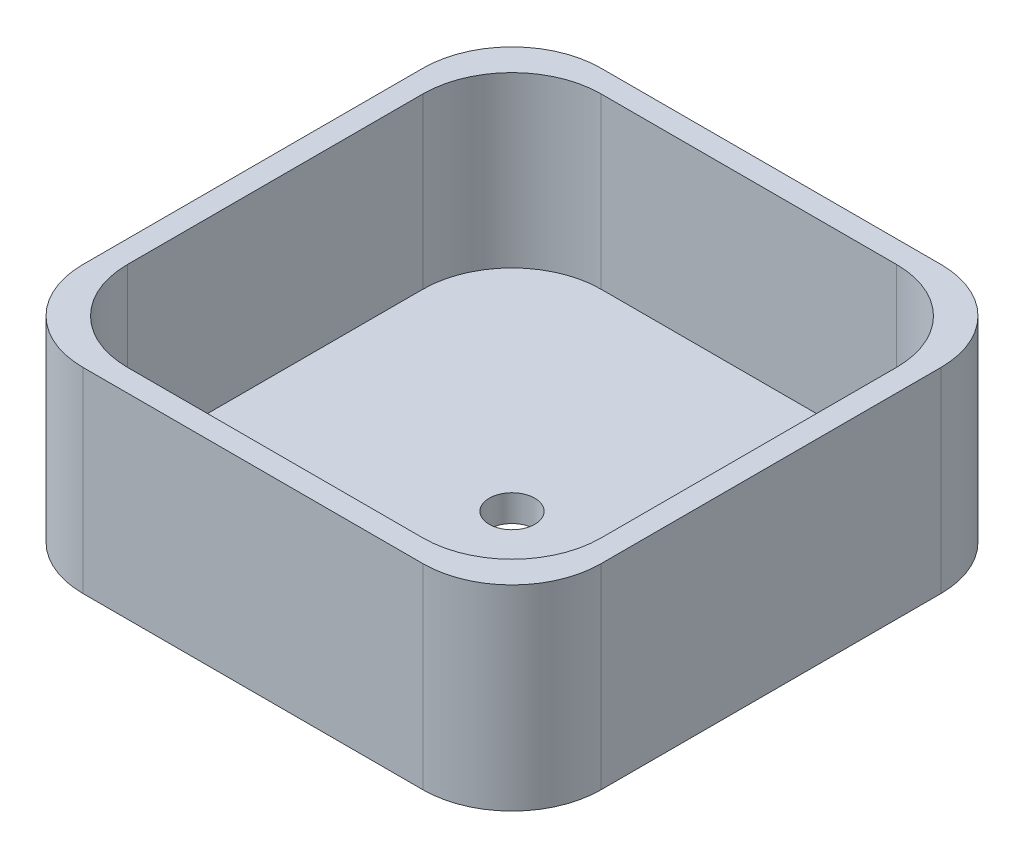
ISO-10303-21;
HEADER;
FILE_DESCRIPTION(('STEP AP214'),'2;1');
FILE_NAME('part.step','',(''),(''),'','','');
FILE_SCHEMA(('AUTOMOTIVE_DESIGN { 1 0 10303 214 1 1 1 1 }'));
ENDSEC;
DATA;
#1=APPLICATION_CONTEXT('core data for automotive mechanical design processes');
#2=APPLICATION_PROTOCOL_DEFINITION('international standard','automotive_design',2000,#1);
#3=PRODUCT_CONTEXT('',#1,'mechanical');
#4=PRODUCT('Part','Part','',(#3));
#5=PRODUCT_RELATED_PRODUCT_CATEGORY('part','',(#4));
#6=PRODUCT_DEFINITION_FORMATION('','',#4);
#7=PRODUCT_DEFINITION_CONTEXT('part definition',#1,'design');
#8=PRODUCT_DEFINITION('design','',#6,#7);
#9=PRODUCT_DEFINITION_SHAPE('','',#8);
#10=(LENGTH_UNIT() NAMED_UNIT(*) SI_UNIT(.MILLI.,.METRE.));
#11=(NAMED_UNIT(*) PLANE_ANGLE_UNIT() SI_UNIT($,.RADIAN.));
#12=(NAMED_UNIT(*) SI_UNIT($,.STERADIAN.) SOLID_ANGLE_UNIT());
#13=UNCERTAINTY_MEASURE_WITH_UNIT(LENGTH_MEASURE(1.E-05),#10,'distance_accuracy_value','');
#14=(GEOMETRIC_REPRESENTATION_CONTEXT(3) GLOBAL_UNCERTAINTY_ASSIGNED_CONTEXT((#13)) GLOBAL_UNIT_ASSIGNED_CONTEXT((#10,
#11,#12)) REPRESENTATION_CONTEXT('',''));
#15=CARTESIAN_POINT('',(0.,0.,0.));
#16=DIRECTION('',(0.,0.,1.));
#17=DIRECTION('',(1.,0.,0.));
#18=AXIS2_PLACEMENT_3D('',#15,#16,#17);
#19=CARTESIAN_POINT('',(-29.1,22.,29.1));
#20=DIRECTION('',(-1.,0.,0.));
#21=DIRECTION('',(0.,0.,1.));
#22=AXIS2_PLACEMENT_3D('',#19,#20,#21);
#23=PLANE('',#22);
#24=DIRECTION('',(0.,0.,-1.));
#25=VECTOR('',#24,1.);
#26=CARTESIAN_POINT('',(-29.1,22.,29.1));
#27=LINE('',#26,#25);
#28=CARTESIAN_POINT('',(-29.1,22.,19.1));
#29=VERTEX_POINT('',#28);
#30=CARTESIAN_POINT('',(-29.1,22.,-19.1));
#31=VERTEX_POINT('',#30);
#32=EDGE_CURVE('E309',#29,#31,#27,.T.);
#33=ORIENTED_EDGE('',*,*,#32,.T.);
#34=DIRECTION('',(0.,-1.,0.));
#35=VECTOR('',#34,1.);
#36=CARTESIAN_POINT('',(-29.1,22.,-19.1));
#37=LINE('',#36,#35);
#38=CARTESIAN_POINT('',(-29.1,0.,-19.1));
#39=VERTEX_POINT('',#38);
#40=EDGE_CURVE('E238',#31,#39,#37,.T.);
#41=ORIENTED_EDGE('',*,*,#40,.T.);
#42=DIRECTION('',(0.,0.,-1.));
#43=VECTOR('',#42,1.);
#44=CARTESIAN_POINT('',(-29.1,0.,29.1));
#45=LINE('',#44,#43);
#46=CARTESIAN_POINT('',(-29.1,0.,19.1));
#47=VERTEX_POINT('',#46);
#48=EDGE_CURVE('E186',#47,#39,#45,.T.);
#49=ORIENTED_EDGE('',*,*,#48,.F.);
#50=DIRECTION('',(0.,-1.,0.));
#51=VECTOR('',#50,1.);
#52=CARTESIAN_POINT('',(-29.1,22.,19.1));
#53=LINE('',#52,#51);
#54=EDGE_CURVE('E235',#47,#29,#53,.F.);
#55=ORIENTED_EDGE('',*,*,#54,.T.);
#56=EDGE_LOOP('',(#33,#41,#49,#55));
#57=FACE_BOUND('',#56,.T.);
#58=ADVANCED_FACE('F65',(#57),#23,.T.);
#59=CARTESIAN_POINT('',(-29.1,22.,29.1));
#60=DIRECTION('',(0.,0.,-1.));
#61=DIRECTION('',(-1.,0.,0.));
#62=AXIS2_PLACEMENT_3D('',#59,#60,#61);
#63=PLANE('',#62);
#64=DIRECTION('',(1.,0.,0.));
#65=VECTOR('',#64,1.);
#66=CARTESIAN_POINT('',(-29.1,22.,29.1));
#67=LINE('',#66,#65);
#68=CARTESIAN_POINT('',(-19.1,22.,29.1));
#69=VERTEX_POINT('',#68);
#70=CARTESIAN_POINT('',(19.1,22.,29.1));
#71=VERTEX_POINT('',#70);
#72=EDGE_CURVE('E209',#69,#71,#67,.T.);
#73=ORIENTED_EDGE('',*,*,#72,.F.);
#74=DIRECTION('',(0.,-1.,0.));
#75=VECTOR('',#74,1.);
#76=CARTESIAN_POINT('',(-19.1,0.,29.1));
#77=LINE('',#76,#75);
#78=CARTESIAN_POINT('',(-19.1,0.,29.1));
#79=VERTEX_POINT('',#78);
#80=EDGE_CURVE('E244',#69,#79,#77,.T.);
#81=ORIENTED_EDGE('',*,*,#80,.T.);
#82=DIRECTION('',(1.,0.,0.));
#83=VECTOR('',#82,1.);
#84=CARTESIAN_POINT('',(-29.1,0.,29.1));
#85=LINE('',#84,#83);
#86=CARTESIAN_POINT('',(19.1,0.,29.1));
#87=VERTEX_POINT('',#86);
#88=EDGE_CURVE('E219',#79,#87,#85,.T.);
#89=ORIENTED_EDGE('',*,*,#88,.T.);
#90=DIRECTION('',(0.,-1.,0.));
#91=VECTOR('',#90,1.);
#92=CARTESIAN_POINT('',(19.1,22.,29.1));
#93=LINE('',#92,#91);
#94=EDGE_CURVE('E241',#87,#71,#93,.F.);
#95=ORIENTED_EDGE('',*,*,#94,.T.);
#96=EDGE_LOOP('',(#73,#81,#89,#95));
#97=FACE_BOUND('',#96,.T.);
#98=ADVANCED_FACE('F345',(#97),#63,.F.);
#99=CARTESIAN_POINT('',(29.1,22.,29.1));
#100=DIRECTION('',(-1.,0.,0.));
#101=DIRECTION('',(0.,0.,1.));
#102=AXIS2_PLACEMENT_3D('',#99,#100,#101);
#103=PLANE('',#102);
#104=DIRECTION('',(0.,0.,-1.));
#105=VECTOR('',#104,1.);
#106=CARTESIAN_POINT('',(29.1,0.,29.1));
#107=LINE('',#106,#105);
#108=CARTESIAN_POINT('',(29.1,0.,19.1));
#109=VERTEX_POINT('',#108);
#110=CARTESIAN_POINT('',(29.1,0.,-19.1));
#111=VERTEX_POINT('',#110);
#112=EDGE_CURVE('E204',#109,#111,#107,.T.);
#113=ORIENTED_EDGE('',*,*,#112,.T.);
#114=DIRECTION('',(0.,-1.,0.));
#115=VECTOR('',#114,1.);
#116=CARTESIAN_POINT('',(29.1,22.,-19.1));
#117=LINE('',#116,#115);
#118=CARTESIAN_POINT('',(29.1,22.,-19.1));
#119=VERTEX_POINT('',#118);
#120=EDGE_CURVE('E232',#111,#119,#117,.F.);
#121=ORIENTED_EDGE('',*,*,#120,.T.);
#122=DIRECTION('',(0.,0.,-1.));
#123=VECTOR('',#122,1.);
#124=CARTESIAN_POINT('',(29.1,22.,29.1));
#125=LINE('',#124,#123);
#126=CARTESIAN_POINT('',(29.1,22.,19.1));
#127=VERTEX_POINT('',#126);
#128=EDGE_CURVE('E216',#127,#119,#125,.T.);
#129=ORIENTED_EDGE('',*,*,#128,.F.);
#130=DIRECTION('',(0.,-1.,0.));
#131=VECTOR('',#130,1.);
#132=CARTESIAN_POINT('',(29.1,22.,19.1));
#133=LINE('',#132,#131);
#134=EDGE_CURVE('E228',#127,#109,#133,.T.);
#135=ORIENTED_EDGE('',*,*,#134,.T.);
#136=EDGE_LOOP('',(#113,#121,#129,#135));
#137=FACE_BOUND('',#136,.T.);
#138=ADVANCED_FACE('F332',(#137),#103,.F.);
#139=CARTESIAN_POINT('',(-29.1,22.,-29.1));
#140=DIRECTION('',(0.,0.,-1.));
#141=DIRECTION('',(-1.,0.,0.));
#142=AXIS2_PLACEMENT_3D('',#139,#140,#141);
#143=PLANE('',#142);
#144=DIRECTION('',(1.,0.,0.));
#145=VECTOR('',#144,1.);
#146=CARTESIAN_POINT('',(-29.1,22.,-29.1));
#147=LINE('',#146,#145);
#148=CARTESIAN_POINT('',(-19.1,22.,-29.1));
#149=VERTEX_POINT('',#148);
#150=CARTESIAN_POINT('',(19.1,22.,-29.1));
#151=VERTEX_POINT('',#150);
#152=EDGE_CURVE('E311',#149,#151,#147,.T.);
#153=ORIENTED_EDGE('',*,*,#152,.T.);
#154=DIRECTION('',(0.,-1.,0.));
#155=VECTOR('',#154,1.);
#156=CARTESIAN_POINT('',(19.1,0.,-29.1));
#157=LINE('',#156,#155);
#158=CARTESIAN_POINT('',(19.1,0.,-29.1));
#159=VERTEX_POINT('',#158);
#160=EDGE_CURVE('E202',#151,#159,#157,.T.);
#161=ORIENTED_EDGE('',*,*,#160,.T.);
#162=DIRECTION('',(1.,0.,0.));
#163=VECTOR('',#162,1.);
#164=CARTESIAN_POINT('',(-29.1,0.,-29.1));
#165=LINE('',#164,#163);
#166=CARTESIAN_POINT('',(-19.1,0.,-29.1));
#167=VERTEX_POINT('',#166);
#168=EDGE_CURVE('E184',#167,#159,#165,.T.);
#169=ORIENTED_EDGE('',*,*,#168,.F.);
#170=DIRECTION('',(0.,-1.,0.));
#171=VECTOR('',#170,1.);
#172=CARTESIAN_POINT('',(-19.1,22.,-29.1));
#173=LINE('',#172,#171);
#174=EDGE_CURVE('E199',#167,#149,#173,.F.);
#175=ORIENTED_EDGE('',*,*,#174,.T.);
#176=EDGE_LOOP('',(#153,#161,#169,#175));
#177=FACE_BOUND('',#176,.T.);
#178=ADVANCED_FACE('F198',(#177),#143,.T.);
#179=CARTESIAN_POINT('',(0.,22.,0.));
#180=DIRECTION('',(0.,-1.,0.));
#181=DIRECTION('',(0.,0.,-1.));
#182=AXIS2_PLACEMENT_3D('',#179,#180,#181);
#183=PLANE('',#182);
#184=DIRECTION('',(1.,0.,0.));
#185=VECTOR('',#184,1.);
#186=CARTESIAN_POINT('',(-26.6,22.,26.6));
#187=LINE('',#186,#185);
#188=CARTESIAN_POINT('',(-16.6,22.,26.6));
#189=VERTEX_POINT('',#188);
#190=CARTESIAN_POINT('',(16.6,22.,26.6));
#191=VERTEX_POINT('',#190);
#192=EDGE_CURVE('E559',#189,#191,#187,.T.);
#193=ORIENTED_EDGE('',*,*,#192,.F.);
#194=CARTESIAN_POINT('',(-16.6,22.,16.6));
#195=DIRECTION('',(0.,-1.,0.));
#196=DIRECTION('',(0.,0.,-1.));
#197=AXIS2_PLACEMENT_3D('',#194,#195,#196);
#198=CIRCLE('',#197,10.);
#199=CARTESIAN_POINT('',(-26.6,22.,16.6));
#200=VERTEX_POINT('',#199);
#201=EDGE_CURVE('E290',#189,#200,#198,.T.);
#202=ORIENTED_EDGE('',*,*,#201,.T.);
#203=DIRECTION('',(0.,0.,-1.));
#204=VECTOR('',#203,1.);
#205=CARTESIAN_POINT('',(-26.6,22.,26.6));
#206=LINE('',#205,#204);
#207=CARTESIAN_POINT('',(-26.6,22.,-16.6));
#208=VERTEX_POINT('',#207);
#209=EDGE_CURVE('E321',#200,#208,#206,.T.);
#210=ORIENTED_EDGE('',*,*,#209,.T.);
#211=CARTESIAN_POINT('',(-16.6,22.,-16.6));
#212=DIRECTION('',(0.,-1.,0.));
#213=DIRECTION('',(0.,0.,-1.));
#214=AXIS2_PLACEMENT_3D('',#211,#212,#213);
#215=CIRCLE('',#214,10.);
#216=CARTESIAN_POINT('',(-16.6,22.,-26.6));
#217=VERTEX_POINT('',#216);
#218=EDGE_CURVE('E88',#208,#217,#215,.T.);
#219=ORIENTED_EDGE('',*,*,#218,.T.);
#220=DIRECTION('',(1.,0.,0.));
#221=VECTOR('',#220,1.);
#222=CARTESIAN_POINT('',(-26.6,22.,-26.6));
#223=LINE('',#222,#221);
#224=CARTESIAN_POINT('',(16.6,22.,-26.6));
#225=VERTEX_POINT('',#224);
#226=EDGE_CURVE('E533',#217,#225,#223,.T.);
#227=ORIENTED_EDGE('',*,*,#226,.T.);
#228=CARTESIAN_POINT('',(16.6,22.,-16.6));
#229=DIRECTION('',(0.,-1.,0.));
#230=DIRECTION('',(0.,0.,-1.));
#231=AXIS2_PLACEMENT_3D('',#228,#229,#230);
#232=CIRCLE('',#231,10.);
#233=CARTESIAN_POINT('',(26.6,22.,-16.6));
#234=VERTEX_POINT('',#233);
#235=EDGE_CURVE('E293',#225,#234,#232,.T.);
#236=ORIENTED_EDGE('',*,*,#235,.T.);
#237=DIRECTION('',(0.,0.,-1.));
#238=VECTOR('',#237,1.);
#239=CARTESIAN_POINT('',(26.6,22.,26.6));
#240=LINE('',#239,#238);
#241=CARTESIAN_POINT('',(26.6,22.,16.6));
#242=VERTEX_POINT('',#241);
#243=EDGE_CURVE('E556',#242,#234,#240,.T.);
#244=ORIENTED_EDGE('',*,*,#243,.F.);
#245=CARTESIAN_POINT('',(16.6,22.,16.6));
#246=DIRECTION('',(0.,-1.,0.));
#247=DIRECTION('',(0.,0.,-1.));
#248=AXIS2_PLACEMENT_3D('',#245,#246,#247);
#249=CIRCLE('',#248,10.);
#250=EDGE_CURVE('E287',#242,#191,#249,.T.);
#251=ORIENTED_EDGE('',*,*,#250,.T.);
#252=EDGE_LOOP('',(#193,#202,#210,#219,#227,#236,#244,#251));
#253=FACE_BOUND('',#252,.T.);
#254=ORIENTED_EDGE('',*,*,#128,.T.);
#255=CARTESIAN_POINT('',(19.1,22.,-19.1));
#256=DIRECTION('',(0.,-1.,0.));
#257=DIRECTION('',(0.,0.,-1.));
#258=AXIS2_PLACEMENT_3D('',#255,#256,#257);
#259=CIRCLE('',#258,10.);
#260=EDGE_CURVE('E12',#119,#151,#259,.F.);
#261=ORIENTED_EDGE('',*,*,#260,.T.);
#262=ORIENTED_EDGE('',*,*,#152,.F.);
#263=CARTESIAN_POINT('',(-19.1,22.,-19.1));
#264=DIRECTION('',(0.,-1.,0.));
#265=DIRECTION('',(0.,0.,-1.));
#266=AXIS2_PLACEMENT_3D('',#263,#264,#265);
#267=CIRCLE('',#266,10.);
#268=EDGE_CURVE('E74',#149,#31,#267,.F.);
#269=ORIENTED_EDGE('',*,*,#268,.T.);
#270=ORIENTED_EDGE('',*,*,#32,.F.);
#271=CARTESIAN_POINT('',(-19.1,22.,19.1));
#272=DIRECTION('',(0.,-1.,0.));
#273=DIRECTION('',(0.,0.,-1.));
#274=AXIS2_PLACEMENT_3D('',#271,#272,#273);
#275=CIRCLE('',#274,10.);
#276=EDGE_CURVE('E301',#29,#69,#275,.F.);
#277=ORIENTED_EDGE('',*,*,#276,.T.);
#278=ORIENTED_EDGE('',*,*,#72,.T.);
#279=CARTESIAN_POINT('',(19.1,22.,19.1));
#280=DIRECTION('',(0.,-1.,0.));
#281=DIRECTION('',(0.,0.,-1.));
#282=AXIS2_PLACEMENT_3D('',#279,#280,#281);
#283=CIRCLE('',#282,10.);
#284=EDGE_CURVE('E298',#71,#127,#283,.F.);
#285=ORIENTED_EDGE('',*,*,#284,.T.);
#286=EDGE_LOOP('',(#254,#261,#262,#269,#270,#277,#278,#285));
#287=FACE_BOUND('',#286,.T.);
#288=ADVANCED_FACE('F308',(#253,#287),#183,.F.);
#289=CARTESIAN_POINT('',(0.,0.,0.));
#290=DIRECTION('',(0.,-1.,0.));
#291=DIRECTION('',(0.,0.,-1.));
#292=AXIS2_PLACEMENT_3D('',#289,#290,#291);
#293=PLANE('',#292);
#294=ORIENTED_EDGE('',*,*,#168,.T.);
#295=CARTESIAN_POINT('',(19.1,0.,-19.1));
#296=DIRECTION('',(0.,-1.,0.));
#297=DIRECTION('',(0.,0.,-1.));
#298=AXIS2_PLACEMENT_3D('',#295,#296,#297);
#299=CIRCLE('',#298,10.);
#300=EDGE_CURVE('E192',#159,#111,#299,.T.);
#301=ORIENTED_EDGE('',*,*,#300,.T.);
#302=ORIENTED_EDGE('',*,*,#112,.F.);
#303=CARTESIAN_POINT('',(19.1,0.,19.1));
#304=DIRECTION('',(0.,-1.,0.));
#305=DIRECTION('',(0.,0.,-1.));
#306=AXIS2_PLACEMENT_3D('',#303,#304,#305);
#307=CIRCLE('',#306,10.);
#308=EDGE_CURVE('E213',#109,#87,#307,.T.);
#309=ORIENTED_EDGE('',*,*,#308,.T.);
#310=ORIENTED_EDGE('',*,*,#88,.F.);
#311=CARTESIAN_POINT('',(-19.1,0.,19.1));
#312=DIRECTION('',(0.,-1.,0.));
#313=DIRECTION('',(0.,0.,-1.));
#314=AXIS2_PLACEMENT_3D('',#311,#312,#313);
#315=CIRCLE('',#314,10.);
#316=EDGE_CURVE('E193',#79,#47,#315,.T.);
#317=ORIENTED_EDGE('',*,*,#316,.T.);
#318=ORIENTED_EDGE('',*,*,#48,.T.);
#319=CARTESIAN_POINT('',(-19.1,0.,-19.1));
#320=DIRECTION('',(0.,-1.,0.));
#321=DIRECTION('',(0.,0.,-1.));
#322=AXIS2_PLACEMENT_3D('',#319,#320,#321);
#323=CIRCLE('',#322,10.);
#324=EDGE_CURVE('E180',#39,#167,#323,.T.);
#325=ORIENTED_EDGE('',*,*,#324,.T.);
#326=EDGE_LOOP('',(#294,#301,#302,#309,#310,#317,#318,#325));
#327=FACE_BOUND('',#326,.T.);
#328=CARTESIAN_POINT('',(0.,0.,0.));
#329=DIRECTION('',(0.,1.,0.));
#330=DIRECTION('',(0.,0.,1.));
#331=AXIS2_PLACEMENT_3D('',#328,#329,#330);
#332=CIRCLE('',#331,2.55);
#333=CARTESIAN_POINT('',(0.,0.,2.55000000000001));
#334=VERTEX_POINT('',#333);
#335=EDGE_CURVE('E549',#334,#334,#332,.T.);
#336=ORIENTED_EDGE('',*,*,#335,.T.);
#337=EDGE_LOOP('',(#336));
#338=FACE_BOUND('',#337,.T.);
#339=ADVANCED_FACE('F182',(#327,#338),#293,.T.);
#340=CARTESIAN_POINT('',(-26.6,22.,-26.6));
#341=DIRECTION('',(0.,0.,-1.));
#342=DIRECTION('',(-1.,0.,0.));
#343=AXIS2_PLACEMENT_3D('',#340,#341,#342);
#344=PLANE('',#343);
#345=DIRECTION('',(1.,0.,0.));
#346=VECTOR('',#345,1.);
#347=CARTESIAN_POINT('',(0.,3.,-26.6));
#348=LINE('',#347,#346);
#349=CARTESIAN_POINT('',(-16.6,3.,-26.6));
#350=VERTEX_POINT('',#349);
#351=CARTESIAN_POINT('',(16.6,3.,-26.6));
#352=VERTEX_POINT('',#351);
#353=EDGE_CURVE('E532',#350,#352,#348,.T.);
#354=ORIENTED_EDGE('',*,*,#353,.T.);
#355=DIRECTION('',(0.,-1.,0.));
#356=VECTOR('',#355,1.);
#357=CARTESIAN_POINT('',(16.6,22.,-26.6));
#358=LINE('',#357,#356);
#359=EDGE_CURVE('E81',#352,#225,#358,.F.);
#360=ORIENTED_EDGE('',*,*,#359,.T.);
#361=ORIENTED_EDGE('',*,*,#226,.F.);
#362=DIRECTION('',(0.,-1.,0.));
#363=VECTOR('',#362,1.);
#364=CARTESIAN_POINT('',(-16.6,3.,-26.6));
#365=LINE('',#364,#363);
#366=EDGE_CURVE('E281',#217,#350,#365,.T.);
#367=ORIENTED_EDGE('',*,*,#366,.T.);
#368=EDGE_LOOP('',(#354,#360,#361,#367));
#369=FACE_BOUND('',#368,.T.);
#370=ADVANCED_FACE('F388',(#369),#344,.F.);
#371=CARTESIAN_POINT('',(-26.6,22.,26.6));
#372=DIRECTION('',(-1.,0.,0.));
#373=DIRECTION('',(0.,0.,1.));
#374=AXIS2_PLACEMENT_3D('',#371,#372,#373);
#375=PLANE('',#374);
#376=ORIENTED_EDGE('',*,*,#209,.F.);
#377=DIRECTION('',(0.,-1.,0.));
#378=VECTOR('',#377,1.);
#379=CARTESIAN_POINT('',(-26.6,22.,16.6));
#380=LINE('',#379,#378);
#381=CARTESIAN_POINT('',(-26.6,3.,16.6));
#382=VERTEX_POINT('',#381);
#383=EDGE_CURVE('E277',#200,#382,#380,.T.);
#384=ORIENTED_EDGE('',*,*,#383,.T.);
#385=DIRECTION('',(0.,0.,-1.));
#386=VECTOR('',#385,1.);
#387=CARTESIAN_POINT('',(-26.6,3.,0.));
#388=LINE('',#387,#386);
#389=CARTESIAN_POINT('',(-26.6,3.,-16.6));
#390=VERTEX_POINT('',#389);
#391=EDGE_CURVE('E539',#382,#390,#388,.T.);
#392=ORIENTED_EDGE('',*,*,#391,.T.);
#393=DIRECTION('',(0.,-1.,0.));
#394=VECTOR('',#393,1.);
#395=CARTESIAN_POINT('',(-26.6,22.,-16.6));
#396=LINE('',#395,#394);
#397=EDGE_CURVE('E274',#390,#208,#396,.F.);
#398=ORIENTED_EDGE('',*,*,#397,.T.);
#399=EDGE_LOOP('',(#376,#384,#392,#398));
#400=FACE_BOUND('',#399,.T.);
#401=ADVANCED_FACE('F384',(#400),#375,.F.);
#402=CARTESIAN_POINT('',(-26.6,22.,26.6));
#403=DIRECTION('',(0.,0.,-1.));
#404=DIRECTION('',(-1.,0.,0.));
#405=AXIS2_PLACEMENT_3D('',#402,#403,#404);
#406=PLANE('',#405);
#407=ORIENTED_EDGE('',*,*,#192,.T.);
#408=DIRECTION('',(0.,-1.,0.));
#409=VECTOR('',#408,1.);
#410=CARTESIAN_POINT('',(16.6,3.,26.6));
#411=LINE('',#410,#409);
#412=CARTESIAN_POINT('',(16.6,3.,26.6));
#413=VERTEX_POINT('',#412);
#414=EDGE_CURVE('E251',#191,#413,#411,.T.);
#415=ORIENTED_EDGE('',*,*,#414,.T.);
#416=DIRECTION('',(1.,0.,0.));
#417=VECTOR('',#416,1.);
#418=CARTESIAN_POINT('',(0.,3.,26.6));
#419=LINE('',#418,#417);
#420=CARTESIAN_POINT('',(-16.6,3.,26.6));
#421=VERTEX_POINT('',#420);
#422=EDGE_CURVE('E545',#421,#413,#419,.T.);
#423=ORIENTED_EDGE('',*,*,#422,.F.);
#424=DIRECTION('',(0.,-1.,0.));
#425=VECTOR('',#424,1.);
#426=CARTESIAN_POINT('',(-16.6,22.,26.6));
#427=LINE('',#426,#425);
#428=EDGE_CURVE('E248',#421,#189,#427,.F.);
#429=ORIENTED_EDGE('',*,*,#428,.T.);
#430=EDGE_LOOP('',(#407,#415,#423,#429));
#431=FACE_BOUND('',#430,.T.);
#432=ADVANCED_FACE('F387',(#431),#406,.T.);
#433=CARTESIAN_POINT('',(26.6,22.,26.6));
#434=DIRECTION('',(-1.,0.,0.));
#435=DIRECTION('',(0.,0.,1.));
#436=AXIS2_PLACEMENT_3D('',#433,#434,#435);
#437=PLANE('',#436);
#438=DIRECTION('',(0.,0.,-1.));
#439=VECTOR('',#438,1.);
#440=CARTESIAN_POINT('',(26.6,3.,0.));
#441=LINE('',#440,#439);
#442=CARTESIAN_POINT('',(26.6,3.,16.6));
#443=VERTEX_POINT('',#442);
#444=CARTESIAN_POINT('',(26.6,3.,-16.6));
#445=VERTEX_POINT('',#444);
#446=EDGE_CURVE('E540',#443,#445,#441,.T.);
#447=ORIENTED_EDGE('',*,*,#446,.F.);
#448=DIRECTION('',(0.,-1.,0.));
#449=VECTOR('',#448,1.);
#450=CARTESIAN_POINT('',(26.6,22.,16.6));
#451=LINE('',#450,#449);
#452=EDGE_CURVE('E271',#443,#242,#451,.F.);
#453=ORIENTED_EDGE('',*,*,#452,.T.);
#454=ORIENTED_EDGE('',*,*,#243,.T.);
#455=DIRECTION('',(0.,-1.,0.));
#456=VECTOR('',#455,1.);
#457=CARTESIAN_POINT('',(26.6,22.,-16.6));
#458=LINE('',#457,#456);
#459=EDGE_CURVE('E267',#234,#445,#458,.T.);
#460=ORIENTED_EDGE('',*,*,#459,.T.);
#461=EDGE_LOOP('',(#447,#453,#454,#460));
#462=FACE_BOUND('',#461,.T.);
#463=ADVANCED_FACE('F378',(#462),#437,.T.);
#464=CARTESIAN_POINT('',(0.,3.,0.));
#465=DIRECTION('',(0.,-1.,0.));
#466=DIRECTION('',(0.,0.,-1.));
#467=AXIS2_PLACEMENT_3D('',#464,#465,#466);
#468=CYLINDRICAL_SURFACE('',#467,2.55);
#469=CARTESIAN_POINT('',(0.,3.,0.));
#470=DIRECTION('',(0.,1.,0.));
#471=DIRECTION('',(0.,0.,1.));
#472=AXIS2_PLACEMENT_3D('',#469,#470,#471);
#473=CIRCLE('',#472,2.55);
#474=CARTESIAN_POINT('',(0.,3.,2.55000000000001));
#475=VERTEX_POINT('',#474);
#476=EDGE_CURVE('E553',#475,#475,#473,.T.);
#477=ORIENTED_EDGE('',*,*,#476,.T.);
#478=EDGE_LOOP('',(#477));
#479=FACE_BOUND('',#478,.T.);
#480=ORIENTED_EDGE('',*,*,#335,.F.);
#481=EDGE_LOOP('',(#480));
#482=FACE_BOUND('',#481,.T.);
#483=ADVANCED_FACE('F372',(#479,#482),#468,.F.);
#484=CARTESIAN_POINT('',(0.,3.,0.));
#485=DIRECTION('',(0.,1.,0.));
#486=DIRECTION('',(0.,0.,1.));
#487=AXIS2_PLACEMENT_3D('',#484,#485,#486);
#488=PLANE('',#487);
#489=ORIENTED_EDGE('',*,*,#476,.F.);
#490=EDGE_LOOP('',(#489));
#491=FACE_BOUND('',#490,.T.);
#492=ORIENTED_EDGE('',*,*,#422,.T.);
#493=CARTESIAN_POINT('',(16.6,3.,16.6));
#494=DIRECTION('',(0.,1.,0.));
#495=DIRECTION('',(0.,0.,1.));
#496=AXIS2_PLACEMENT_3D('',#493,#494,#495);
#497=CIRCLE('',#496,10.);
#498=EDGE_CURVE('E264',#413,#443,#497,.T.);
#499=ORIENTED_EDGE('',*,*,#498,.T.);
#500=ORIENTED_EDGE('',*,*,#446,.T.);
#501=CARTESIAN_POINT('',(16.6,3.,-16.6));
#502=DIRECTION('',(0.,1.,0.));
#503=DIRECTION('',(0.,0.,1.));
#504=AXIS2_PLACEMENT_3D('',#501,#502,#503);
#505=CIRCLE('',#504,10.);
#506=EDGE_CURVE('E258',#445,#352,#505,.T.);
#507=ORIENTED_EDGE('',*,*,#506,.T.);
#508=ORIENTED_EDGE('',*,*,#353,.F.);
#509=CARTESIAN_POINT('',(-16.6,3.,-16.6));
#510=DIRECTION('',(0.,1.,0.));
#511=DIRECTION('',(0.,0.,1.));
#512=AXIS2_PLACEMENT_3D('',#509,#510,#511);
#513=CIRCLE('',#512,10.);
#514=EDGE_CURVE('E255',#350,#390,#513,.T.);
#515=ORIENTED_EDGE('',*,*,#514,.T.);
#516=ORIENTED_EDGE('',*,*,#391,.F.);
#517=CARTESIAN_POINT('',(-16.6,3.,16.6));
#518=DIRECTION('',(0.,1.,0.));
#519=DIRECTION('',(0.,0.,1.));
#520=AXIS2_PLACEMENT_3D('',#517,#518,#519);
#521=CIRCLE('',#520,10.);
#522=EDGE_CURVE('E261',#382,#421,#521,.T.);
#523=ORIENTED_EDGE('',*,*,#522,.T.);
#524=EDGE_LOOP('',(#492,#499,#500,#507,#508,#515,#516,#523));
#525=FACE_BOUND('',#524,.T.);
#526=ADVANCED_FACE('F368',(#491,#525),#488,.T.);
#527=CARTESIAN_POINT('',(19.1,22.,-19.1));
#528=DIRECTION('',(0.,1.,0.));
#529=DIRECTION('',(0.,0.,1.));
#530=AXIS2_PLACEMENT_3D('',#527,#528,#529);
#531=CYLINDRICAL_SURFACE('',#530,10.);
#532=ORIENTED_EDGE('',*,*,#260,.F.);
#533=ORIENTED_EDGE('',*,*,#120,.F.);
#534=ORIENTED_EDGE('',*,*,#300,.F.);
#535=ORIENTED_EDGE('',*,*,#160,.F.);
#536=EDGE_LOOP('',(#532,#533,#534,#535));
#537=FACE_BOUND('',#536,.T.);
#538=ADVANCED_FACE('F337',(#537),#531,.T.);
#539=CARTESIAN_POINT('',(-19.1,22.,-19.1));
#540=DIRECTION('',(0.,-1.,0.));
#541=DIRECTION('',(0.,0.,-1.));
#542=AXIS2_PLACEMENT_3D('',#539,#540,#541);
#543=CYLINDRICAL_SURFACE('',#542,10.);
#544=ORIENTED_EDGE('',*,*,#268,.F.);
#545=ORIENTED_EDGE('',*,*,#174,.F.);
#546=ORIENTED_EDGE('',*,*,#324,.F.);
#547=ORIENTED_EDGE('',*,*,#40,.F.);
#548=EDGE_LOOP('',(#544,#545,#546,#547));
#549=FACE_BOUND('',#548,.T.);
#550=ADVANCED_FACE('F207',(#549),#543,.T.);
#551=CARTESIAN_POINT('',(-19.1,22.,19.1));
#552=DIRECTION('',(0.,1.,0.));
#553=DIRECTION('',(0.,0.,1.));
#554=AXIS2_PLACEMENT_3D('',#551,#552,#553);
#555=CYLINDRICAL_SURFACE('',#554,10.);
#556=ORIENTED_EDGE('',*,*,#276,.F.);
#557=ORIENTED_EDGE('',*,*,#54,.F.);
#558=ORIENTED_EDGE('',*,*,#316,.F.);
#559=ORIENTED_EDGE('',*,*,#80,.F.);
#560=EDGE_LOOP('',(#556,#557,#558,#559));
#561=FACE_BOUND('',#560,.T.);
#562=ADVANCED_FACE('F348',(#561),#555,.T.);
#563=CARTESIAN_POINT('',(19.1,22.,19.1));
#564=DIRECTION('',(0.,-1.,0.));
#565=DIRECTION('',(0.,0.,-1.));
#566=AXIS2_PLACEMENT_3D('',#563,#564,#565);
#567=CYLINDRICAL_SURFACE('',#566,10.);
#568=ORIENTED_EDGE('',*,*,#284,.F.);
#569=ORIENTED_EDGE('',*,*,#94,.F.);
#570=ORIENTED_EDGE('',*,*,#308,.F.);
#571=ORIENTED_EDGE('',*,*,#134,.F.);
#572=EDGE_LOOP('',(#568,#569,#570,#571));
#573=FACE_BOUND('',#572,.T.);
#574=ADVANCED_FACE('F340',(#573),#567,.T.);
#575=CARTESIAN_POINT('',(16.6,22.,16.6));
#576=DIRECTION('',(0.,1.,0.));
#577=DIRECTION('',(0.,0.,1.));
#578=AXIS2_PLACEMENT_3D('',#575,#576,#577);
#579=CYLINDRICAL_SURFACE('',#578,10.);
#580=ORIENTED_EDGE('',*,*,#250,.F.);
#581=ORIENTED_EDGE('',*,*,#452,.F.);
#582=ORIENTED_EDGE('',*,*,#498,.F.);
#583=ORIENTED_EDGE('',*,*,#414,.F.);
#584=EDGE_LOOP('',(#580,#581,#582,#583));
#585=FACE_BOUND('',#584,.T.);
#586=ADVANCED_FACE('F355',(#585),#579,.F.);
#587=CARTESIAN_POINT('',(-16.6,22.,16.6));
#588=DIRECTION('',(0.,-1.,0.));
#589=DIRECTION('',(0.,0.,-1.));
#590=AXIS2_PLACEMENT_3D('',#587,#588,#589);
#591=CYLINDRICAL_SURFACE('',#590,10.);
#592=ORIENTED_EDGE('',*,*,#201,.F.);
#593=ORIENTED_EDGE('',*,*,#428,.F.);
#594=ORIENTED_EDGE('',*,*,#522,.F.);
#595=ORIENTED_EDGE('',*,*,#383,.F.);
#596=EDGE_LOOP('',(#592,#593,#594,#595));
#597=FACE_BOUND('',#596,.T.);
#598=ADVANCED_FACE('F498',(#597),#591,.F.);
#599=CARTESIAN_POINT('',(16.6,22.,-16.6));
#600=DIRECTION('',(0.,-1.,0.));
#601=DIRECTION('',(0.,0.,-1.));
#602=AXIS2_PLACEMENT_3D('',#599,#600,#601);
#603=CYLINDRICAL_SURFACE('',#602,10.);
#604=ORIENTED_EDGE('',*,*,#235,.F.);
#605=ORIENTED_EDGE('',*,*,#359,.F.);
#606=ORIENTED_EDGE('',*,*,#506,.F.);
#607=ORIENTED_EDGE('',*,*,#459,.F.);
#608=EDGE_LOOP('',(#604,#605,#606,#607));
#609=FACE_BOUND('',#608,.T.);
#610=ADVANCED_FACE('F507',(#609),#603,.F.);
#611=CARTESIAN_POINT('',(-16.6,22.,-16.6));
#612=DIRECTION('',(0.,1.,0.));
#613=DIRECTION('',(0.,0.,1.));
#614=AXIS2_PLACEMENT_3D('',#611,#612,#613);
#615=CYLINDRICAL_SURFACE('',#614,10.);
#616=ORIENTED_EDGE('',*,*,#218,.F.);
#617=ORIENTED_EDGE('',*,*,#397,.F.);
#618=ORIENTED_EDGE('',*,*,#514,.F.);
#619=ORIENTED_EDGE('',*,*,#366,.F.);
#620=EDGE_LOOP('',(#616,#617,#618,#619));
#621=FACE_BOUND('',#620,.T.);
#622=ADVANCED_FACE('F67',(#621),#615,.F.);
#623=CLOSED_SHELL('',(#58,#98,#138,#178,#288,#339,#370,#401,#432,#463,#483,#526,#538,#550,#562,
#574,#586,#598,#610,#622));
#624=MANIFOLD_SOLID_BREP('B2',#623);
#625=ADVANCED_BREP_SHAPE_REPRESENTATION('',(#18,#624),#14);
#626=SHAPE_DEFINITION_REPRESENTATION(#9,#625);
ENDSEC;
END-ISO-10303-21;
